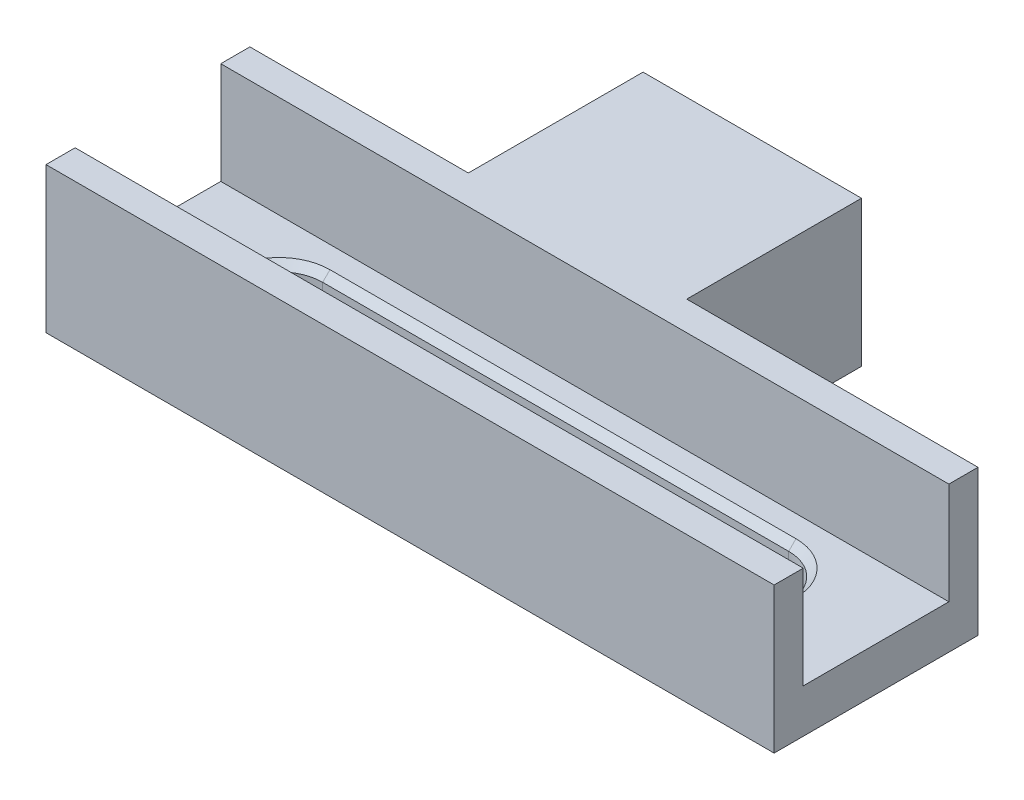
ISO-10303-21;
HEADER;
FILE_DESCRIPTION(('STEP AP214'),'2;1');
FILE_NAME('part.step','',(''),(''),'','','');
FILE_SCHEMA(('AUTOMOTIVE_DESIGN { 1 0 10303 214 1 1 1 1 }'));
ENDSEC;
DATA;
#1=APPLICATION_CONTEXT('core data for automotive mechanical design processes');
#2=APPLICATION_PROTOCOL_DEFINITION('international standard','automotive_design',2000,#1);
#3=PRODUCT_CONTEXT('',#1,'mechanical');
#4=PRODUCT('Part','Part','',(#3));
#5=PRODUCT_RELATED_PRODUCT_CATEGORY('part','',(#4));
#6=PRODUCT_DEFINITION_FORMATION('','',#4);
#7=PRODUCT_DEFINITION_CONTEXT('part definition',#1,'design');
#8=PRODUCT_DEFINITION('design','',#6,#7);
#9=PRODUCT_DEFINITION_SHAPE('','',#8);
#10=(LENGTH_UNIT() NAMED_UNIT(*) SI_UNIT(.MILLI.,.METRE.));
#11=(NAMED_UNIT(*) PLANE_ANGLE_UNIT() SI_UNIT($,.RADIAN.));
#12=(NAMED_UNIT(*) SI_UNIT($,.STERADIAN.) SOLID_ANGLE_UNIT());
#13=UNCERTAINTY_MEASURE_WITH_UNIT(LENGTH_MEASURE(1.E-05),#10,'distance_accuracy_value','');
#14=(GEOMETRIC_REPRESENTATION_CONTEXT(3) GLOBAL_UNCERTAINTY_ASSIGNED_CONTEXT((#13)) GLOBAL_UNIT_ASSIGNED_CONTEXT((#10,
#11,#12)) REPRESENTATION_CONTEXT('',''));
#15=CARTESIAN_POINT('',(0.,0.,0.));
#16=DIRECTION('',(0.,0.,1.));
#17=DIRECTION('',(1.,0.,0.));
#18=AXIS2_PLACEMENT_3D('',#15,#16,#17);
#19=CARTESIAN_POINT('',(0.,0.,0.));
#20=DIRECTION('',(0.,1.,0.));
#21=DIRECTION('',(0.,0.,1.));
#22=AXIS2_PLACEMENT_3D('',#19,#20,#21);
#23=PLANE('',#22);
#24=CARTESIAN_POINT('',(16.,0.,0.));
#25=DIRECTION('',(0.,1.,0.));
#26=DIRECTION('',(0.,0.,1.));
#27=AXIS2_PLACEMENT_3D('',#24,#25,#26);
#28=CIRCLE('',#27,3.5);
#29=CARTESIAN_POINT('',(16.,0.,3.49999999999999));
#30=VERTEX_POINT('',#29);
#31=CARTESIAN_POINT('',(16.,0.,-3.50000000000001));
#32=VERTEX_POINT('',#31);
#33=EDGE_CURVE('E300',#30,#32,#28,.T.);
#34=ORIENTED_EDGE('',*,*,#33,.T.);
#35=DIRECTION('',(-1.,0.,0.));
#36=VECTOR('',#35,1.);
#37=CARTESIAN_POINT('',(-16.,0.,-3.5));
#38=LINE('',#37,#36);
#39=CARTESIAN_POINT('',(-16.,0.,-3.5));
#40=VERTEX_POINT('',#39);
#41=EDGE_CURVE('E304',#32,#40,#38,.T.);
#42=ORIENTED_EDGE('',*,*,#41,.T.);
#43=CARTESIAN_POINT('',(-16.,0.,0.));
#44=DIRECTION('',(0.,1.,0.));
#45=DIRECTION('',(0.,0.,1.));
#46=AXIS2_PLACEMENT_3D('',#43,#44,#45);
#47=CIRCLE('',#46,3.5);
#48=CARTESIAN_POINT('',(-16.,0.,3.5));
#49=VERTEX_POINT('',#48);
#50=EDGE_CURVE('E302',#40,#49,#47,.T.);
#51=ORIENTED_EDGE('',*,*,#50,.T.);
#52=DIRECTION('',(1.,0.,0.));
#53=VECTOR('',#52,1.);
#54=CARTESIAN_POINT('',(16.,0.,3.49999999999999));
#55=LINE('',#54,#53);
#56=EDGE_CURVE('E298',#49,#30,#55,.T.);
#57=ORIENTED_EDGE('',*,*,#56,.T.);
#58=EDGE_LOOP('',(#34,#42,#51,#57));
#59=FACE_BOUND('',#58,.T.);
#60=DIRECTION('',(0.,0.,-1.));
#61=VECTOR('',#60,1.);
#62=CARTESIAN_POINT('',(25.,0.,-7.));
#63=LINE('',#62,#61);
#64=CARTESIAN_POINT('',(25.,0.,7.));
#65=VERTEX_POINT('',#64);
#66=CARTESIAN_POINT('',(25.,0.,-7.));
#67=VERTEX_POINT('',#66);
#68=EDGE_CURVE('E233',#65,#67,#63,.T.);
#69=ORIENTED_EDGE('',*,*,#68,.F.);
#70=DIRECTION('',(1.,0.,0.));
#71=VECTOR('',#70,1.);
#72=CARTESIAN_POINT('',(-25.,0.,7.));
#73=LINE('',#72,#71);
#74=CARTESIAN_POINT('',(-25.,0.,7.));
#75=VERTEX_POINT('',#74);
#76=EDGE_CURVE('E269',#75,#65,#73,.T.);
#77=ORIENTED_EDGE('',*,*,#76,.F.);
#78=DIRECTION('',(0.,0.,1.));
#79=VECTOR('',#78,1.);
#80=CARTESIAN_POINT('',(-25.,0.,-7.));
#81=LINE('',#80,#79);
#82=CARTESIAN_POINT('',(-25.,0.,-7.));
#83=VERTEX_POINT('',#82);
#84=EDGE_CURVE('E267',#83,#75,#81,.T.);
#85=ORIENTED_EDGE('',*,*,#84,.F.);
#86=DIRECTION('',(-1.,0.,0.));
#87=VECTOR('',#86,1.);
#88=CARTESIAN_POINT('',(-25.,0.,-7.));
#89=LINE('',#88,#87);
#90=CARTESIAN_POINT('',(-10.,0.,-7.));
#91=VERTEX_POINT('',#90);
#92=EDGE_CURVE('E265',#91,#83,#89,.T.);
#93=ORIENTED_EDGE('',*,*,#92,.F.);
#94=DIRECTION('',(0.,0.,1.));
#95=VECTOR('',#94,1.);
#96=CARTESIAN_POINT('',(-10.,0.,-7.));
#97=LINE('',#96,#95);
#98=CARTESIAN_POINT('',(-10.,0.,-19.));
#99=VERTEX_POINT('',#98);
#100=EDGE_CURVE('E263',#99,#91,#97,.T.);
#101=ORIENTED_EDGE('',*,*,#100,.F.);
#102=DIRECTION('',(-1.,0.,0.));
#103=VECTOR('',#102,1.);
#104=CARTESIAN_POINT('',(-10.,0.,-19.));
#105=LINE('',#104,#103);
#106=CARTESIAN_POINT('',(4.99999999999999,0.,-19.));
#107=VERTEX_POINT('',#106);
#108=EDGE_CURVE('E261',#107,#99,#105,.T.);
#109=ORIENTED_EDGE('',*,*,#108,.F.);
#110=DIRECTION('',(0.,0.,-1.));
#111=VECTOR('',#110,1.);
#112=CARTESIAN_POINT('',(4.99999999999999,0.,-19.));
#113=LINE('',#112,#111);
#114=CARTESIAN_POINT('',(4.99999999999999,0.,-7.));
#115=VERTEX_POINT('',#114);
#116=EDGE_CURVE('E259',#115,#107,#113,.T.);
#117=ORIENTED_EDGE('',*,*,#116,.F.);
#118=DIRECTION('',(-1.,0.,0.));
#119=VECTOR('',#118,1.);
#120=CARTESIAN_POINT('',(4.99999999999999,0.,-7.));
#121=LINE('',#120,#119);
#122=EDGE_CURVE('E257',#67,#115,#121,.T.);
#123=ORIENTED_EDGE('',*,*,#122,.F.);
#124=EDGE_LOOP('',(#69,#77,#85,#93,#101,#109,#117,#123));
#125=FACE_BOUND('',#124,.T.);
#126=ADVANCED_FACE('F36',(#59,#125),#23,.F.);
#127=CARTESIAN_POINT('',(46.,3.,5.));
#128=DIRECTION('',(0.,-1.,0.));
#129=DIRECTION('',(0.,0.,-1.));
#130=AXIS2_PLACEMENT_3D('',#127,#128,#129);
#131=PLANE('',#130);
#132=CARTESIAN_POINT('',(-16.,3.,0.));
#133=DIRECTION('',(0.,-1.,0.));
#134=DIRECTION('',(0.,0.,-1.));
#135=AXIS2_PLACEMENT_3D('',#132,#133,#134);
#136=CIRCLE('',#135,3.49999999999999);
#137=CARTESIAN_POINT('',(-16.,3.,3.49999999999999));
#138=VERTEX_POINT('',#137);
#139=CARTESIAN_POINT('',(-16.,3.,-3.49999999999999));
#140=VERTEX_POINT('',#139);
#141=EDGE_CURVE('E54',#138,#140,#136,.T.);
#142=ORIENTED_EDGE('',*,*,#141,.T.);
#143=DIRECTION('',(1.,0.,0.));
#144=VECTOR('',#143,1.);
#145=CARTESIAN_POINT('',(16.,3.,-3.5));
#146=LINE('',#145,#144);
#147=CARTESIAN_POINT('',(16.,3.,-3.5));
#148=VERTEX_POINT('',#147);
#149=EDGE_CURVE('E330',#140,#148,#146,.T.);
#150=ORIENTED_EDGE('',*,*,#149,.T.);
#151=CARTESIAN_POINT('',(16.,3.,0.));
#152=DIRECTION('',(0.,-1.,0.));
#153=DIRECTION('',(0.,0.,-1.));
#154=AXIS2_PLACEMENT_3D('',#151,#152,#153);
#155=CIRCLE('',#154,3.49999999999999);
#156=CARTESIAN_POINT('',(16.,3.,3.49999999999999));
#157=VERTEX_POINT('',#156);
#158=EDGE_CURVE('E327',#148,#157,#155,.T.);
#159=ORIENTED_EDGE('',*,*,#158,.T.);
#160=DIRECTION('',(-1.,0.,0.));
#161=VECTOR('',#160,1.);
#162=CARTESIAN_POINT('',(-16.,3.,3.49999999999999));
#163=LINE('',#162,#161);
#164=EDGE_CURVE('E325',#157,#138,#163,.T.);
#165=ORIENTED_EDGE('',*,*,#164,.T.);
#166=EDGE_LOOP('',(#142,#150,#159,#165));
#167=FACE_BOUND('',#166,.T.);
#168=DIRECTION('',(-1.,0.,0.));
#169=VECTOR('',#168,1.);
#170=CARTESIAN_POINT('',(46.,3.,-5.));
#171=LINE('',#170,#169);
#172=CARTESIAN_POINT('',(25.,3.,-5.));
#173=VERTEX_POINT('',#172);
#174=CARTESIAN_POINT('',(-25.,3.,-5.));
#175=VERTEX_POINT('',#174);
#176=EDGE_CURVE('E220',#173,#175,#171,.T.);
#177=ORIENTED_EDGE('',*,*,#176,.T.);
#178=DIRECTION('',(0.,0.,1.));
#179=VECTOR('',#178,1.);
#180=CARTESIAN_POINT('',(-25.,3.,5.));
#181=LINE('',#180,#179);
#182=CARTESIAN_POINT('',(-25.,3.,5.));
#183=VERTEX_POINT('',#182);
#184=EDGE_CURVE('E215',#175,#183,#181,.T.);
#185=ORIENTED_EDGE('',*,*,#184,.T.);
#186=DIRECTION('',(-1.,0.,0.));
#187=VECTOR('',#186,1.);
#188=CARTESIAN_POINT('',(46.,3.,5.));
#189=LINE('',#188,#187);
#190=CARTESIAN_POINT('',(25.,3.,5.));
#191=VERTEX_POINT('',#190);
#192=EDGE_CURVE('E221',#191,#183,#189,.T.);
#193=ORIENTED_EDGE('',*,*,#192,.F.);
#194=DIRECTION('',(0.,0.,1.));
#195=VECTOR('',#194,1.);
#196=CARTESIAN_POINT('',(25.,3.,-7.));
#197=LINE('',#196,#195);
#198=EDGE_CURVE('E230',#173,#191,#197,.T.);
#199=ORIENTED_EDGE('',*,*,#198,.F.);
#200=EDGE_LOOP('',(#177,#185,#193,#199));
#201=FACE_BOUND('',#200,.T.);
#202=ADVANCED_FACE('F365',(#167,#201),#131,.F.);
#203=CARTESIAN_POINT('',(0.,10.,0.));
#204=DIRECTION('',(0.,1.,0.));
#205=DIRECTION('',(0.,0.,1.));
#206=AXIS2_PLACEMENT_3D('',#203,#204,#205);
#207=PLANE('',#206);
#208=DIRECTION('',(-1.,0.,0.));
#209=VECTOR('',#208,1.);
#210=CARTESIAN_POINT('',(0.,10.,-5.));
#211=LINE('',#210,#209);
#212=CARTESIAN_POINT('',(25.,10.,-5.));
#213=VERTEX_POINT('',#212);
#214=CARTESIAN_POINT('',(-25.,10.,-5.));
#215=VERTEX_POINT('',#214);
#216=EDGE_CURVE('E296',#213,#215,#211,.T.);
#217=ORIENTED_EDGE('',*,*,#216,.F.);
#218=DIRECTION('',(0.,0.,-1.));
#219=VECTOR('',#218,1.);
#220=CARTESIAN_POINT('',(25.,10.,-7.));
#221=LINE('',#220,#219);
#222=CARTESIAN_POINT('',(25.,10.,-7.));
#223=VERTEX_POINT('',#222);
#224=EDGE_CURVE('E238',#213,#223,#221,.T.);
#225=ORIENTED_EDGE('',*,*,#224,.T.);
#226=DIRECTION('',(-1.,0.,0.));
#227=VECTOR('',#226,1.);
#228=CARTESIAN_POINT('',(4.99999999999999,10.,-7.));
#229=LINE('',#228,#227);
#230=CARTESIAN_POINT('',(4.99999999999999,10.,-7.));
#231=VERTEX_POINT('',#230);
#232=EDGE_CURVE('E237',#223,#231,#229,.T.);
#233=ORIENTED_EDGE('',*,*,#232,.T.);
#234=DIRECTION('',(0.,0.,-1.));
#235=VECTOR('',#234,1.);
#236=CARTESIAN_POINT('',(4.99999999999999,10.,-19.));
#237=LINE('',#236,#235);
#238=CARTESIAN_POINT('',(4.99999999999999,10.,-19.));
#239=VERTEX_POINT('',#238);
#240=EDGE_CURVE('E240',#231,#239,#237,.T.);
#241=ORIENTED_EDGE('',*,*,#240,.T.);
#242=DIRECTION('',(-1.,0.,0.));
#243=VECTOR('',#242,1.);
#244=CARTESIAN_POINT('',(-10.,10.,-19.));
#245=LINE('',#244,#243);
#246=CARTESIAN_POINT('',(-10.,10.,-19.));
#247=VERTEX_POINT('',#246);
#248=EDGE_CURVE('E242',#239,#247,#245,.T.);
#249=ORIENTED_EDGE('',*,*,#248,.T.);
#250=DIRECTION('',(0.,0.,1.));
#251=VECTOR('',#250,1.);
#252=CARTESIAN_POINT('',(-10.,10.,-7.));
#253=LINE('',#252,#251);
#254=CARTESIAN_POINT('',(-10.,10.,-7.));
#255=VERTEX_POINT('',#254);
#256=EDGE_CURVE('E244',#247,#255,#253,.T.);
#257=ORIENTED_EDGE('',*,*,#256,.T.);
#258=DIRECTION('',(-1.,0.,0.));
#259=VECTOR('',#258,1.);
#260=CARTESIAN_POINT('',(-25.,10.,-7.));
#261=LINE('',#260,#259);
#262=CARTESIAN_POINT('',(-25.,10.,-7.));
#263=VERTEX_POINT('',#262);
#264=EDGE_CURVE('E246',#255,#263,#261,.T.);
#265=ORIENTED_EDGE('',*,*,#264,.T.);
#266=DIRECTION('',(0.,0.,1.));
#267=VECTOR('',#266,1.);
#268=CARTESIAN_POINT('',(-25.,10.,-7.));
#269=LINE('',#268,#267);
#270=EDGE_CURVE('E249',#263,#215,#269,.T.);
#271=ORIENTED_EDGE('',*,*,#270,.T.);
#272=EDGE_LOOP('',(#217,#225,#233,#241,#249,#257,#265,#271));
#273=FACE_BOUND('',#272,.T.);
#274=ADVANCED_FACE('F450',(#273),#207,.T.);
#275=CARTESIAN_POINT('',(25.,10.,-7.));
#276=DIRECTION('',(-1.,0.,0.));
#277=DIRECTION('',(0.,0.,1.));
#278=AXIS2_PLACEMENT_3D('',#275,#276,#277);
#279=PLANE('',#278);
#280=ORIENTED_EDGE('',*,*,#224,.F.);
#281=DIRECTION('',(0.,-1.,0.));
#282=VECTOR('',#281,1.);
#283=CARTESIAN_POINT('',(25.,10.,-5.));
#284=LINE('',#283,#282);
#285=EDGE_CURVE('E227',#213,#173,#284,.T.);
#286=ORIENTED_EDGE('',*,*,#285,.T.);
#287=ORIENTED_EDGE('',*,*,#198,.T.);
#288=DIRECTION('',(0.,1.,0.));
#289=VECTOR('',#288,1.);
#290=CARTESIAN_POINT('',(25.,10.,5.));
#291=LINE('',#290,#289);
#292=CARTESIAN_POINT('',(25.,10.,5.));
#293=VERTEX_POINT('',#292);
#294=EDGE_CURVE('E223',#191,#293,#291,.T.);
#295=ORIENTED_EDGE('',*,*,#294,.T.);
#296=CARTESIAN_POINT('',(25.,10.,7.));
#297=VERTEX_POINT('',#296);
#298=EDGE_CURVE('E234',#297,#293,#221,.T.);
#299=ORIENTED_EDGE('',*,*,#298,.F.);
#300=DIRECTION('',(0.,-1.,0.));
#301=VECTOR('',#300,1.);
#302=CARTESIAN_POINT('',(25.,10.,7.));
#303=LINE('',#302,#301);
#304=EDGE_CURVE('E254',#297,#65,#303,.T.);
#305=ORIENTED_EDGE('',*,*,#304,.T.);
#306=ORIENTED_EDGE('',*,*,#68,.T.);
#307=DIRECTION('',(0.,-1.,0.));
#308=VECTOR('',#307,1.);
#309=CARTESIAN_POINT('',(25.,10.,-7.));
#310=LINE('',#309,#308);
#311=EDGE_CURVE('E291',#223,#67,#310,.T.);
#312=ORIENTED_EDGE('',*,*,#311,.F.);
#313=EDGE_LOOP('',(#280,#286,#287,#295,#299,#305,#306,#312));
#314=FACE_BOUND('',#313,.T.);
#315=ADVANCED_FACE('F412',(#314),#279,.F.);
#316=CARTESIAN_POINT('',(4.99999999999999,10.,-7.));
#317=DIRECTION('',(0.,0.,1.));
#318=DIRECTION('',(1.,0.,0.));
#319=AXIS2_PLACEMENT_3D('',#316,#317,#318);
#320=PLANE('',#319);
#321=ORIENTED_EDGE('',*,*,#122,.T.);
#322=DIRECTION('',(0.,-1.,0.));
#323=VECTOR('',#322,1.);
#324=CARTESIAN_POINT('',(4.99999999999999,10.,-7.));
#325=LINE('',#324,#323);
#326=EDGE_CURVE('E288',#231,#115,#325,.T.);
#327=ORIENTED_EDGE('',*,*,#326,.F.);
#328=ORIENTED_EDGE('',*,*,#232,.F.);
#329=ORIENTED_EDGE('',*,*,#311,.T.);
#330=EDGE_LOOP('',(#321,#327,#328,#329));
#331=FACE_BOUND('',#330,.T.);
#332=ADVANCED_FACE('F447',(#331),#320,.F.);
#333=CARTESIAN_POINT('',(4.99999999999999,10.,-19.));
#334=DIRECTION('',(-1.,0.,0.));
#335=DIRECTION('',(0.,0.,1.));
#336=AXIS2_PLACEMENT_3D('',#333,#334,#335);
#337=PLANE('',#336);
#338=ORIENTED_EDGE('',*,*,#116,.T.);
#339=DIRECTION('',(0.,-1.,0.));
#340=VECTOR('',#339,1.);
#341=CARTESIAN_POINT('',(4.99999999999999,10.,-19.));
#342=LINE('',#341,#340);
#343=EDGE_CURVE('E285',#239,#107,#342,.T.);
#344=ORIENTED_EDGE('',*,*,#343,.F.);
#345=ORIENTED_EDGE('',*,*,#240,.F.);
#346=ORIENTED_EDGE('',*,*,#326,.T.);
#347=EDGE_LOOP('',(#338,#344,#345,#346));
#348=FACE_BOUND('',#347,.T.);
#349=ADVANCED_FACE('F442',(#348),#337,.F.);
#350=CARTESIAN_POINT('',(-10.,10.,-19.));
#351=DIRECTION('',(0.,0.,1.));
#352=DIRECTION('',(1.,0.,0.));
#353=AXIS2_PLACEMENT_3D('',#350,#351,#352);
#354=PLANE('',#353);
#355=CARTESIAN_POINT('',(0.,5.,-19.));
#356=DIRECTION('',(0.,0.,1.));
#357=DIRECTION('',(1.,0.,0.));
#358=AXIS2_PLACEMENT_3D('',#355,#356,#357);
#359=CIRCLE('',#358,2.999995);
#360=CARTESIAN_POINT('',(2.999995,5.,-19.));
#361=VERTEX_POINT('',#360);
#362=EDGE_CURVE('E11',#361,#361,#359,.T.);
#363=ORIENTED_EDGE('',*,*,#362,.T.);
#364=EDGE_LOOP('',(#363));
#365=FACE_BOUND('',#364,.T.);
#366=ORIENTED_EDGE('',*,*,#108,.T.);
#367=DIRECTION('',(0.,-1.,0.));
#368=VECTOR('',#367,1.);
#369=CARTESIAN_POINT('',(-10.,10.,-19.));
#370=LINE('',#369,#368);
#371=EDGE_CURVE('E282',#247,#99,#370,.T.);
#372=ORIENTED_EDGE('',*,*,#371,.F.);
#373=ORIENTED_EDGE('',*,*,#248,.F.);
#374=ORIENTED_EDGE('',*,*,#343,.T.);
#375=EDGE_LOOP('',(#366,#372,#373,#374));
#376=FACE_BOUND('',#375,.T.);
#377=ADVANCED_FACE('F439',(#365,#376),#354,.F.);
#378=CARTESIAN_POINT('',(-10.,10.,-7.));
#379=DIRECTION('',(1.,0.,0.));
#380=DIRECTION('',(0.,0.,-1.));
#381=AXIS2_PLACEMENT_3D('',#378,#379,#380);
#382=PLANE('',#381);
#383=CARTESIAN_POINT('',(-10.,5.,-13.));
#384=DIRECTION('',(1.,0.,0.));
#385=DIRECTION('',(0.,0.,-1.));
#386=AXIS2_PLACEMENT_3D('',#383,#384,#385);
#387=CIRCLE('',#386,2.75000000000001);
#388=CARTESIAN_POINT('',(-10.,5.,-15.75));
#389=VERTEX_POINT('',#388);
#390=EDGE_CURVE('E335',#389,#389,#387,.T.);
#391=ORIENTED_EDGE('',*,*,#390,.T.);
#392=EDGE_LOOP('',(#391));
#393=FACE_BOUND('',#392,.T.);
#394=ORIENTED_EDGE('',*,*,#100,.T.);
#395=DIRECTION('',(0.,-1.,0.));
#396=VECTOR('',#395,1.);
#397=CARTESIAN_POINT('',(-10.,10.,-7.));
#398=LINE('',#397,#396);
#399=EDGE_CURVE('E279',#255,#91,#398,.T.);
#400=ORIENTED_EDGE('',*,*,#399,.F.);
#401=ORIENTED_EDGE('',*,*,#256,.F.);
#402=ORIENTED_EDGE('',*,*,#371,.T.);
#403=EDGE_LOOP('',(#394,#400,#401,#402));
#404=FACE_BOUND('',#403,.T.);
#405=ADVANCED_FACE('F435',(#393,#404),#382,.F.);
#406=CARTESIAN_POINT('',(-25.,10.,-7.));
#407=DIRECTION('',(0.,0.,1.));
#408=DIRECTION('',(1.,0.,0.));
#409=AXIS2_PLACEMENT_3D('',#406,#407,#408);
#410=PLANE('',#409);
#411=ORIENTED_EDGE('',*,*,#92,.T.);
#412=DIRECTION('',(0.,-1.,0.));
#413=VECTOR('',#412,1.);
#414=CARTESIAN_POINT('',(-25.,10.,-7.));
#415=LINE('',#414,#413);
#416=EDGE_CURVE('E276',#263,#83,#415,.T.);
#417=ORIENTED_EDGE('',*,*,#416,.F.);
#418=ORIENTED_EDGE('',*,*,#264,.F.);
#419=ORIENTED_EDGE('',*,*,#399,.T.);
#420=EDGE_LOOP('',(#411,#417,#418,#419));
#421=FACE_BOUND('',#420,.T.);
#422=ADVANCED_FACE('F430',(#421),#410,.F.);
#423=CARTESIAN_POINT('',(-25.,10.,-7.));
#424=DIRECTION('',(1.,0.,0.));
#425=DIRECTION('',(0.,0.,-1.));
#426=AXIS2_PLACEMENT_3D('',#423,#424,#425);
#427=PLANE('',#426);
#428=ORIENTED_EDGE('',*,*,#184,.F.);
#429=DIRECTION('',(0.,-1.,0.));
#430=VECTOR('',#429,1.);
#431=CARTESIAN_POINT('',(-25.,3.,-5.));
#432=LINE('',#431,#430);
#433=EDGE_CURVE('E212',#215,#175,#432,.T.);
#434=ORIENTED_EDGE('',*,*,#433,.F.);
#435=ORIENTED_EDGE('',*,*,#270,.F.);
#436=ORIENTED_EDGE('',*,*,#416,.T.);
#437=ORIENTED_EDGE('',*,*,#84,.T.);
#438=DIRECTION('',(0.,-1.,0.));
#439=VECTOR('',#438,1.);
#440=CARTESIAN_POINT('',(-25.,10.,7.));
#441=LINE('',#440,#439);
#442=CARTESIAN_POINT('',(-25.,10.,7.));
#443=VERTEX_POINT('',#442);
#444=EDGE_CURVE('E273',#443,#75,#441,.T.);
#445=ORIENTED_EDGE('',*,*,#444,.F.);
#446=CARTESIAN_POINT('',(-25.,10.,5.));
#447=VERTEX_POINT('',#446);
#448=EDGE_CURVE('E248',#447,#443,#269,.T.);
#449=ORIENTED_EDGE('',*,*,#448,.F.);
#450=DIRECTION('',(0.,1.,0.));
#451=VECTOR('',#450,1.);
#452=CARTESIAN_POINT('',(-25.,3.,5.));
#453=LINE('',#452,#451);
#454=EDGE_CURVE('E218',#183,#447,#453,.T.);
#455=ORIENTED_EDGE('',*,*,#454,.F.);
#456=EDGE_LOOP('',(#428,#434,#435,#436,#437,#445,#449,#455));
#457=FACE_BOUND('',#456,.T.);
#458=ADVANCED_FACE('F422',(#457),#427,.F.);
#459=CARTESIAN_POINT('',(-25.,10.,7.));
#460=DIRECTION('',(0.,0.,-1.));
#461=DIRECTION('',(-1.,0.,0.));
#462=AXIS2_PLACEMENT_3D('',#459,#460,#461);
#463=PLANE('',#462);
#464=ORIENTED_EDGE('',*,*,#76,.T.);
#465=ORIENTED_EDGE('',*,*,#304,.F.);
#466=DIRECTION('',(1.,0.,0.));
#467=VECTOR('',#466,1.);
#468=CARTESIAN_POINT('',(-25.,10.,7.));
#469=LINE('',#468,#467);
#470=EDGE_CURVE('E252',#443,#297,#469,.T.);
#471=ORIENTED_EDGE('',*,*,#470,.F.);
#472=ORIENTED_EDGE('',*,*,#444,.T.);
#473=EDGE_LOOP('',(#464,#465,#471,#472));
#474=FACE_BOUND('',#473,.T.);
#475=ADVANCED_FACE('F417',(#474),#463,.F.);
#476=DIRECTION('',(1.,0.,0.));
#477=VECTOR('',#476,1.);
#478=CARTESIAN_POINT('',(0.,10.,5.));
#479=LINE('',#478,#477);
#480=EDGE_CURVE('E294',#447,#293,#479,.T.);
#481=ORIENTED_EDGE('',*,*,#480,.F.);
#482=ORIENTED_EDGE('',*,*,#448,.T.);
#483=ORIENTED_EDGE('',*,*,#470,.T.);
#484=ORIENTED_EDGE('',*,*,#298,.T.);
#485=EDGE_LOOP('',(#481,#482,#483,#484));
#486=FACE_BOUND('',#485,.T.);
#487=ADVANCED_FACE('F460',(#486),#207,.T.);
#488=CARTESIAN_POINT('',(46.,3.,-5.));
#489=DIRECTION('',(0.,0.,-1.));
#490=DIRECTION('',(-1.,0.,0.));
#491=AXIS2_PLACEMENT_3D('',#488,#489,#490);
#492=PLANE('',#491);
#493=ORIENTED_EDGE('',*,*,#216,.T.);
#494=ORIENTED_EDGE('',*,*,#433,.T.);
#495=ORIENTED_EDGE('',*,*,#176,.F.);
#496=ORIENTED_EDGE('',*,*,#285,.F.);
#497=EDGE_LOOP('',(#493,#494,#495,#496));
#498=FACE_BOUND('',#497,.T.);
#499=ADVANCED_FACE('F453',(#498),#492,.F.);
#500=CARTESIAN_POINT('',(46.,3.,5.));
#501=DIRECTION('',(0.,0.,1.));
#502=DIRECTION('',(1.,0.,0.));
#503=AXIS2_PLACEMENT_3D('',#500,#501,#502);
#504=PLANE('',#503);
#505=ORIENTED_EDGE('',*,*,#192,.T.);
#506=ORIENTED_EDGE('',*,*,#454,.T.);
#507=ORIENTED_EDGE('',*,*,#480,.T.);
#508=ORIENTED_EDGE('',*,*,#294,.F.);
#509=EDGE_LOOP('',(#505,#506,#507,#508));
#510=FACE_BOUND('',#509,.T.);
#511=ADVANCED_FACE('F457',(#510),#504,.F.);
#512=CARTESIAN_POINT('',(-16.,71.,0.));
#513=DIRECTION('',(0.,-1.,0.));
#514=DIRECTION('',(0.,0.,-1.));
#515=AXIS2_PLACEMENT_3D('',#512,#513,#514);
#516=CYLINDRICAL_SURFACE('',#515,3.);
#517=DIRECTION('',(0.,-1.,0.));
#518=VECTOR('',#517,1.);
#519=CARTESIAN_POINT('',(-16.,71.,3.));
#520=LINE('',#519,#518);
#521=CARTESIAN_POINT('',(-16.,2.50000000000002,3.));
#522=VERTEX_POINT('',#521);
#523=CARTESIAN_POINT('',(-16.,0.5,3.));
#524=VERTEX_POINT('',#523);
#525=EDGE_CURVE('E209',#522,#524,#520,.T.);
#526=ORIENTED_EDGE('',*,*,#525,.T.);
#527=CARTESIAN_POINT('',(-16.,0.5,0.));
#528=DIRECTION('',(0.,1.,0.));
#529=DIRECTION('',(0.,0.,1.));
#530=AXIS2_PLACEMENT_3D('',#527,#528,#529);
#531=CIRCLE('',#530,3.);
#532=CARTESIAN_POINT('',(-16.,0.5,-3.));
#533=VERTEX_POINT('',#532);
#534=EDGE_CURVE('E315',#524,#533,#531,.F.);
#535=ORIENTED_EDGE('',*,*,#534,.T.);
#536=DIRECTION('',(0.,-1.,0.));
#537=VECTOR('',#536,1.);
#538=CARTESIAN_POINT('',(-16.,71.,-3.));
#539=LINE('',#538,#537);
#540=CARTESIAN_POINT('',(-16.,2.50000000000002,-3.));
#541=VERTEX_POINT('',#540);
#542=EDGE_CURVE('E189',#541,#533,#539,.T.);
#543=ORIENTED_EDGE('',*,*,#542,.F.);
#544=CARTESIAN_POINT('',(-16.,2.50000000000002,0.));
#545=DIRECTION('',(0.,-1.,0.));
#546=DIRECTION('',(0.,0.,-1.));
#547=AXIS2_PLACEMENT_3D('',#544,#545,#546);
#548=CIRCLE('',#547,3.);
#549=EDGE_CURVE('E313',#541,#522,#548,.F.);
#550=ORIENTED_EDGE('',*,*,#549,.T.);
#551=EDGE_LOOP('',(#526,#535,#543,#550));
#552=FACE_BOUND('',#551,.T.);
#553=ADVANCED_FACE('F376',(#552),#516,.F.);
#554=CARTESIAN_POINT('',(-16.,71.,3.));
#555=DIRECTION('',(0.,0.,-1.));
#556=DIRECTION('',(-1.,0.,0.));
#557=AXIS2_PLACEMENT_3D('',#554,#555,#556);
#558=PLANE('',#557);
#559=DIRECTION('',(0.,-1.,0.));
#560=VECTOR('',#559,1.);
#561=CARTESIAN_POINT('',(16.,71.,2.99999999999999));
#562=LINE('',#561,#560);
#563=CARTESIAN_POINT('',(16.,2.50000000000002,2.99999999999999));
#564=VERTEX_POINT('',#563);
#565=CARTESIAN_POINT('',(16.,0.5,2.99999999999999));
#566=VERTEX_POINT('',#565);
#567=EDGE_CURVE('E206',#564,#566,#562,.T.);
#568=ORIENTED_EDGE('',*,*,#567,.T.);
#569=DIRECTION('',(-1.,0.,0.));
#570=VECTOR('',#569,1.);
#571=CARTESIAN_POINT('',(-16.,0.5,3.));
#572=LINE('',#571,#570);
#573=EDGE_CURVE('E323',#566,#524,#572,.T.);
#574=ORIENTED_EDGE('',*,*,#573,.T.);
#575=ORIENTED_EDGE('',*,*,#525,.F.);
#576=DIRECTION('',(1.,0.,0.));
#577=VECTOR('',#576,1.);
#578=CARTESIAN_POINT('',(16.,2.50000000000002,2.99999999999999));
#579=LINE('',#578,#577);
#580=EDGE_CURVE('E321',#522,#564,#579,.T.);
#581=ORIENTED_EDGE('',*,*,#580,.T.);
#582=EDGE_LOOP('',(#568,#574,#575,#581));
#583=FACE_BOUND('',#582,.T.);
#584=ADVANCED_FACE('F393',(#583),#558,.T.);
#585=CARTESIAN_POINT('',(16.,71.,0.));
#586=DIRECTION('',(0.,-1.,0.));
#587=DIRECTION('',(0.,0.,-1.));
#588=AXIS2_PLACEMENT_3D('',#585,#586,#587);
#589=CYLINDRICAL_SURFACE('',#588,3.);
#590=DIRECTION('',(0.,-1.,0.));
#591=VECTOR('',#590,1.);
#592=CARTESIAN_POINT('',(16.,71.,-3.00000000000001));
#593=LINE('',#592,#591);
#594=CARTESIAN_POINT('',(16.,2.50000000000002,-3.00000000000001));
#595=VERTEX_POINT('',#594);
#596=CARTESIAN_POINT('',(16.,0.5,-3.00000000000001));
#597=VERTEX_POINT('',#596);
#598=EDGE_CURVE('E193',#595,#597,#593,.T.);
#599=ORIENTED_EDGE('',*,*,#598,.T.);
#600=CARTESIAN_POINT('',(16.,0.5,0.));
#601=DIRECTION('',(0.,1.,0.));
#602=DIRECTION('',(0.,0.,1.));
#603=AXIS2_PLACEMENT_3D('',#600,#601,#602);
#604=CIRCLE('',#603,3.);
#605=EDGE_CURVE('E319',#597,#566,#604,.F.);
#606=ORIENTED_EDGE('',*,*,#605,.T.);
#607=ORIENTED_EDGE('',*,*,#567,.F.);
#608=CARTESIAN_POINT('',(16.,2.50000000000002,0.));
#609=DIRECTION('',(0.,-1.,0.));
#610=DIRECTION('',(0.,0.,-1.));
#611=AXIS2_PLACEMENT_3D('',#608,#609,#610);
#612=CIRCLE('',#611,3.);
#613=EDGE_CURVE('E317',#564,#595,#612,.F.);
#614=ORIENTED_EDGE('',*,*,#613,.T.);
#615=EDGE_LOOP('',(#599,#606,#607,#614));
#616=FACE_BOUND('',#615,.T.);
#617=ADVANCED_FACE('F389',(#616),#589,.F.);
#618=CARTESIAN_POINT('',(-16.,71.,-3.));
#619=DIRECTION('',(0.,0.,1.));
#620=DIRECTION('',(1.,0.,0.));
#621=AXIS2_PLACEMENT_3D('',#618,#619,#620);
#622=PLANE('',#621);
#623=ORIENTED_EDGE('',*,*,#542,.T.);
#624=DIRECTION('',(1.,0.,0.));
#625=VECTOR('',#624,1.);
#626=CARTESIAN_POINT('',(16.,0.5,-3.00000000000001));
#627=LINE('',#626,#625);
#628=EDGE_CURVE('E310',#533,#597,#627,.T.);
#629=ORIENTED_EDGE('',*,*,#628,.T.);
#630=ORIENTED_EDGE('',*,*,#598,.F.);
#631=DIRECTION('',(-1.,0.,0.));
#632=VECTOR('',#631,1.);
#633=CARTESIAN_POINT('',(-16.,2.50000000000002,-3.));
#634=LINE('',#633,#632);
#635=EDGE_CURVE('E307',#595,#541,#634,.T.);
#636=ORIENTED_EDGE('',*,*,#635,.T.);
#637=EDGE_LOOP('',(#623,#629,#630,#636));
#638=FACE_BOUND('',#637,.T.);
#639=ADVANCED_FACE('F183',(#638),#622,.T.);
#640=CARTESIAN_POINT('',(0.,5.,-9.));
#641=DIRECTION('',(0.,0.,-1.));
#642=DIRECTION('',(-1.,0.,0.));
#643=AXIS2_PLACEMENT_3D('',#640,#641,#642);
#644=CONICAL_SURFACE('',#643,2.499995,1.02974425867665);
#645=CARTESIAN_POINT('',(0.,5.,-7.4978514567342));
#646=VERTEX_POINT('',#645);
#647=VERTEX_LOOP('',#646);
#648=FACE_BOUND('',#647,.T.);
#649=CARTESIAN_POINT('',(0.,5.,-9.));
#650=DIRECTION('',(0.,0.,-1.));
#651=DIRECTION('',(-1.,0.,0.));
#652=AXIS2_PLACEMENT_3D('',#649,#650,#651);
#653=CIRCLE('',#652,2.499995);
#654=CARTESIAN_POINT('',(-2.499995,5.,-9.));
#655=VERTEX_POINT('',#654);
#656=EDGE_CURVE('E187',#655,#655,#653,.T.);
#657=ORIENTED_EDGE('',*,*,#656,.T.);
#658=EDGE_LOOP('',(#657));
#659=FACE_BOUND('',#658,.T.);
#660=ADVANCED_FACE('F179',(#648,#659),#644,.F.);
#661=CARTESIAN_POINT('',(0.,5.,-19.));
#662=DIRECTION('',(0.,0.,-1.));
#663=DIRECTION('',(-1.,0.,0.));
#664=AXIS2_PLACEMENT_3D('',#661,#662,#663);
#665=CYLINDRICAL_SURFACE('',#664,2.499995);
#666=CARTESIAN_POINT('',(0.,5.,-18.5));
#667=DIRECTION('',(0.,0.,1.));
#668=DIRECTION('',(1.,0.,0.));
#669=AXIS2_PLACEMENT_3D('',#666,#667,#668);
#670=CIRCLE('',#669,2.499995);
#671=CARTESIAN_POINT('',(2.499995,5.,-18.5));
#672=VERTEX_POINT('',#671);
#673=EDGE_CURVE('E46',#672,#672,#670,.F.);
#674=ORIENTED_EDGE('',*,*,#673,.T.);
#675=EDGE_LOOP('',(#674));
#676=FACE_BOUND('',#675,.T.);
#677=CARTESIAN_POINT('',(-2.499995,5.,-10.75));
#678=CARTESIAN_POINT('',(-2.49998838826752,4.8957205298802,-10.7500066931264));
#679=CARTESIAN_POINT('',(-2.49341233777929,4.79138615083259,-10.7573071439943));
#680=CARTESIAN_POINT('',(-2.46769093022233,4.58623580190187,-10.7859400435744));
#681=CARTESIAN_POINT('',(-2.44853300540817,4.48542345625089,-10.8072865225825));
#682=CARTESIAN_POINT('',(-2.39938560540671,4.29081780559319,-10.8623076237122));
#683=CARTESIAN_POINT('',(-2.36946569830372,4.19698398678531,-10.8959030840392));
#684=CARTESIAN_POINT('',(-2.30077641001199,4.01731204387475,-10.9735689415588));
#685=CARTESIAN_POINT('',(-2.26200376459213,3.93147688556295,-11.0176432028016));
#686=CARTESIAN_POINT('',(-2.16086924121504,3.73626924586211,-11.1337200869188));
#687=CARTESIAN_POINT('',(-2.09524858951923,3.63105122199896,-11.2098684468943));
#688=CARTESIAN_POINT('',(-1.95562019696749,3.43801678093933,-11.375510352645));
#689=CARTESIAN_POINT('',(-1.88159196874601,3.35024436916422,-11.4650366724838));
#690=CARTESIAN_POINT('',(-1.72802471545608,3.18990435893369,-11.6575619255292));
#691=CARTESIAN_POINT('',(-1.64839715604397,3.11774171673979,-11.7608276265804));
#692=CARTESIAN_POINT('',(-1.53070672933189,3.02276235236547,-11.9243692931153));
#693=CARTESIAN_POINT('',(-1.49178813613121,2.99332516457364,-11.9802924625375));
#694=CARTESIAN_POINT('',(-1.41563278894899,2.93889859074274,-12.0953384411594));
#695=CARTESIAN_POINT('',(-1.37839496867298,2.91390635433615,-12.1544591679391));
#696=CARTESIAN_POINT('',(-1.30729103410878,2.86863105202051,-12.2761430807616));
#697=CARTESIAN_POINT('',(-1.27341344743697,2.8483316241832,-12.3386933356536));
#698=CARTESIAN_POINT('',(-1.21133302760526,2.81278200235864,-12.4679646963219));
#699=CARTESIAN_POINT('',(-1.18312469093493,2.79752690213722,-12.5346816738902));
#700=CARTESIAN_POINT('',(-1.14001910490228,2.77495461870149,-12.6608161021781));
#701=CARTESIAN_POINT('',(-1.12367697058583,2.76673091398119,-12.7195577423786));
#702=CARTESIAN_POINT('',(-1.09996269198607,2.75495170131296,-12.8392240517075));
#703=CARTESIAN_POINT('',(-1.09256635336185,2.75138359998728,-12.9001423718215));
#704=CARTESIAN_POINT('',(-1.088222223918,2.74927631253753,-13.0227938435352));
#705=CARTESIAN_POINT('',(-1.09133073064244,2.75076422281537,-13.0845296137115));
#706=CARTESIAN_POINT('',(-1.10743017618359,2.75865113431396,-13.2064165110454));
#707=CARTESIAN_POINT('',(-1.12044281778481,2.76506092104394,-13.2665638576111));
#708=CARTESIAN_POINT('',(-1.16119591429067,2.78588554560895,-13.4091423643372));
#709=CARTESIAN_POINT('',(-1.19285835251519,2.80255391047832,-13.4900751087266));
#710=CARTESIAN_POINT('',(-1.26492913840279,2.84323196099737,-13.6460673408401));
#711=CARTESIAN_POINT('',(-1.3053740285303,2.86727249883975,-13.7211004485209));
#712=CARTESIAN_POINT('',(-1.38754499885021,2.91987820418881,-13.8606505065666));
#713=CARTESIAN_POINT('',(-1.42895540199517,2.94797757864862,-13.9255348199692));
#714=CARTESIAN_POINT('',(-1.51358676171603,3.00957939509397,-14.0514968903478));
#715=CARTESIAN_POINT('',(-1.5568090739262,3.04308593801549,-14.1125717089698));
#716=CARTESIAN_POINT('',(-1.64364591223606,3.11543155123925,-14.2311458769109));
#717=CARTESIAN_POINT('',(-1.68726030796937,3.15426890619394,-14.2886463677639));
#718=CARTESIAN_POINT('',(-1.77386281594307,3.23733439626065,-14.4001216167817));
#719=CARTESIAN_POINT('',(-1.8168508011426,3.28156360830579,-14.4540956672817));
#720=CARTESIAN_POINT('',(-1.93143153633959,3.40901030077656,-14.5955292086512));
#721=CARTESIAN_POINT('',(-2.00159401894406,3.497562487271,-14.6794627146275));
#722=CARTESIAN_POINT('',(-2.13311105405682,3.69101188207957,-14.8342086068689));
#723=CARTESIAN_POINT('',(-2.19448386605054,3.79587423344595,-14.9050482857025));
#724=CARTESIAN_POINT('',(-2.29135058044118,3.99550286780765,-15.0157758691653));
#725=CARTESIAN_POINT('',(-2.329551542421,4.08706925830629,-15.0590363149267));
#726=CARTESIAN_POINT('',(-2.39574032603503,4.27845321532871,-15.133633865423));
#727=CARTESIAN_POINT('',(-2.42373389269995,4.37826610155047,-15.1649776776249));
#728=CARTESIAN_POINT('',(-2.46752567584851,4.58468027429423,-15.2138943439479));
#729=CARTESIAN_POINT('',(-2.48323222548026,4.69132628218201,-15.2313637026516));
#730=CARTESIAN_POINT('',(-2.50060904831485,4.90714390646898,-15.2506864800213));
#731=CARTESIAN_POINT('',(-2.50228789665921,5.01631393899107,-15.2525494388899));
#732=CARTESIAN_POINT('',(-2.49211854181686,5.22024474639753,-15.2412458755607));
#733=CARTESIAN_POINT('',(-2.48183759749179,5.31519051568853,-15.2298207179193));
#734=CARTESIAN_POINT('',(-2.45104555360494,5.5012430816547,-15.1954969183761));
#735=CARTESIAN_POINT('',(-2.43053301984066,5.59234933818793,-15.172596667963));
#736=CARTESIAN_POINT('',(-2.38001614768182,5.77092694895582,-15.1159326138459));
#737=CARTESIAN_POINT('',(-2.3497906729398,5.85825370161895,-15.0819153661399));
#738=CARTESIAN_POINT('',(-2.28174255305192,6.02557218968548,-15.0047948050789));
#739=CARTESIAN_POINT('',(-2.24391666444206,6.10556077223749,-14.9616876122151));
#740=CARTESIAN_POINT('',(-2.14201302390702,6.29555683265504,-14.8444417035044));
#741=CARTESIAN_POINT('',(-2.07424749418525,6.40065591081861,-14.7655449213525));
#742=CARTESIAN_POINT('',(-1.93049527083766,6.59299329305091,-14.5942266322747));
#743=CARTESIAN_POINT('',(-1.85448474725374,6.68017759788961,-14.5017656347316));
#744=CARTESIAN_POINT('',(-1.73728673563444,6.79860979462333,-14.3533739332628));
#745=CARTESIAN_POINT('',(-1.69720771592765,6.83639174842229,-14.3016363778091));
#746=CARTESIAN_POINT('',(-1.61699518211603,6.90739766301848,-14.1951697506781));
#747=CARTESIAN_POINT('',(-1.5768616873662,6.94062295300383,-14.1404415579178));
#748=CARTESIAN_POINT('',(-1.49753863238363,7.00246754655203,-14.0279766030147));
#749=CARTESIAN_POINT('',(-1.45834742399535,7.03109547906596,-13.9702457529418));
#750=CARTESIAN_POINT('',(-1.38212009747238,7.08371244700231,-13.8513897022843));
#751=CARTESIAN_POINT('',(-1.34508223548956,7.10770527371754,-13.7902673289357));
#752=CARTESIAN_POINT('',(-1.2769979789765,7.14959444061652,-13.6676122771576));
#753=CARTESIAN_POINT('',(-1.24573189292776,7.16775753591634,-13.6062955218653));
#754=CARTESIAN_POINT('',(-1.18928715159192,7.19923024231485,-13.4797145036661));
#755=CARTESIAN_POINT('',(-1.16409970621342,7.21254687603738,-13.4144561135525));
#756=CARTESIAN_POINT('',(-1.12659823869466,7.23184437595543,-13.2908880074625));
#757=CARTESIAN_POINT('',(-1.11286192095913,7.23866275804116,-13.2331587121981));
#758=CARTESIAN_POINT('',(-1.09435190524027,7.24777314210997,-13.1159730473312));
#759=CARTESIAN_POINT('',(-1.08955850228072,7.25007509624977,-13.0565207686539));
#760=CARTESIAN_POINT('',(-1.08987622442378,7.24992093362971,-12.9374997825066));
#761=CARTESIAN_POINT('',(-1.09501226927595,7.247452845589,-12.8779311578913));
#762=CARTESIAN_POINT('',(-1.11419019123383,7.23800414981501,-12.7605780200039));
#763=CARTESIAN_POINT('',(-1.12825167781964,7.23101360544961,-12.7027977296512));
#764=CARTESIAN_POINT('',(-1.17251095488319,7.20818542017789,-12.5593071059226));
#765=CARTESIAN_POINT('',(-1.20732576634032,7.18960345728937,-12.4755092897768));
#766=CARTESIAN_POINT('',(-1.28559963328898,7.14458885960014,-12.3142108557458));
#767=CARTESIAN_POINT('',(-1.32909591661862,7.11812216404137,-12.2367394558271));
#768=CARTESIAN_POINT('',(-1.41601193563586,7.06090952459833,-12.0942026562464));
#769=CARTESIAN_POINT('',(-1.45906233559163,7.03079075439987,-12.0286536126006));
#770=CARTESIAN_POINT('',(-1.54665661639448,6.96490112396103,-11.9014559511314));
#771=CARTESIAN_POINT('',(-1.59120155425324,6.9291261940667,-11.839810186823));
#772=CARTESIAN_POINT('',(-1.68036183414198,6.85198118259378,-11.7202662457182));
#773=CARTESIAN_POINT('',(-1.72497709651714,6.81061539109667,-11.6623652453015));
#774=CARTESIAN_POINT('',(-1.81326121694337,6.72219788471364,-11.5503008386027));
#775=CARTESIAN_POINT('',(-1.85692993697239,6.67514534709384,-11.4961379749231));
#776=CARTESIAN_POINT('',(-1.96898162676868,6.54416633034759,-11.3593339455801));
#777=CARTESIAN_POINT('',(-2.03586568001248,6.455490916922,-11.2799030811061));
#778=CARTESIAN_POINT('',(-2.16069850011387,6.26273445939682,-11.1338382846931));
#779=CARTESIAN_POINT('',(-2.21866339024113,6.15868189675363,-11.0671812065853));
#780=CARTESIAN_POINT('',(-2.31036399156601,5.95992743192265,-10.9626515181095));
#781=CARTESIAN_POINT('',(-2.34662926608803,5.86803892734875,-10.9216714329237));
#782=CARTESIAN_POINT('',(-2.40881107856138,5.67652808680268,-10.8517090110437));
#783=CARTESIAN_POINT('',(-2.43474309981588,5.57691759102017,-10.8227087214638));
#784=CARTESIAN_POINT('',(-2.46942089985651,5.39762226855113,-10.7840087319572));
#785=CARTESIAN_POINT('',(-2.48082898640463,5.31908887873392,-10.7713117555865));
#786=CARTESIAN_POINT('',(-2.49611871769829,5.16038119409969,-10.7543046612499));
#787=CARTESIAN_POINT('',(-2.50000008543208,5.08020683899868,-10.7499948519636));
#788=CARTESIAN_POINT('',(-2.499995,5.,-10.75));
#789=B_SPLINE_CURVE_WITH_KNOTS('',3,(#677,#678,#679,#680,#681,#682,#683,#684,#685,#686,#687,
#688,#689,#690,#691,#692,#693,#694,#695,#696,#697,#698,#699,#700,#701,#702,#703,#704,#705,#706,
#707,#708,#709,#710,#711,#712,#713,#714,#715,#716,#717,#718,#719,#720,#721,#722,#723,#724,#725,
#726,#727,#728,#729,#730,#731,#732,#733,#734,#735,#736,#737,#738,#739,#740,#741,#742,#743,#744,
#745,#746,#747,#748,#749,#750,#751,#752,#753,#754,#755,#756,#757,#758,#759,#760,#761,#762,#763,
#764,#765,#766,#767,#768,#769,#770,#771,#772,#773,#774,#775,#776,#777,#778,#779,#780,#781,#782,
#783,#784,#785,#786,#787,#788),.UNSPECIFIED.,.T.,.F.,(4,2,2,2,2,2,2,2,2,2,2,2,2,2,2,2,2,2,2,2,2,
2,2,2,2,2,2,2,2,2,2,2,2,2,2,2,2,2,2,2,2,2,2,2,2,2,2,2,2,2,2,2,2,2,2,4),(0.,0.312492814024701,
0.625298245672056,0.936116932267578,1.24705041127765,1.68121780057796,2.11646682516243,
2.56192552816744,2.78442422115169,3.00677971620673,3.22834784431081,3.44969983166726,
3.6335864008791,3.81697451975769,4.00134700702191,4.18612467433014,4.45010002804047,
4.71519554100189,4.96069614778256,5.20638383125863,5.45199264193457,5.69765058947769,
6.11824982521237,6.53796223283225,6.86141893489855,7.18469330371782,7.51035703999316,
7.8358216832716,8.12301922688163,8.41025703942963,8.70456263994099,8.998994102647,
9.4401728622869,9.88266253531919,10.1092098340471,10.3356909072646,10.5617417918149,
10.7876069874397,11.0007843728014,11.2136516181037,11.392132580099,11.5702198073986,
11.7487545571272,11.9276829175246,12.2039851323869,12.4814986758406,12.7331946200607,
12.9850724927354,13.2367581757419,13.4884803152342,13.8965731897653,14.3039194570271,
14.6235257901382,14.9426514092304,15.1829972643925,15.4233519650246),.UNSPECIFIED.);
#790=CARTESIAN_POINT('',(-2.499995,5.,-10.75));
#791=VERTEX_POINT('',#790);
#792=EDGE_CURVE('E190',#791,#791,#789,.T.);
#793=ORIENTED_EDGE('',*,*,#792,.F.);
#794=EDGE_LOOP('',(#793));
#795=FACE_BOUND('',#794,.T.);
#796=ORIENTED_EDGE('',*,*,#656,.F.);
#797=EDGE_LOOP('',(#796));
#798=FACE_BOUND('',#797,.T.);
#799=ADVANCED_FACE('F182',(#676,#795,#798),#665,.F.);
#800=CARTESIAN_POINT('',(25.001,5.,-13.));
#801=DIRECTION('',(-1.,0.,0.));
#802=DIRECTION('',(0.,0.,1.));
#803=AXIS2_PLACEMENT_3D('',#800,#801,#802);
#804=CYLINDRICAL_SURFACE('',#803,2.25);
#805=CARTESIAN_POINT('',(-9.50000000000001,5.,-13.));
#806=DIRECTION('',(1.,0.,0.));
#807=DIRECTION('',(0.,0.,-1.));
#808=AXIS2_PLACEMENT_3D('',#805,#806,#807);
#809=CIRCLE('',#808,2.25);
#810=CARTESIAN_POINT('',(-9.50000000000001,5.,-15.25));
#811=VERTEX_POINT('',#810);
#812=EDGE_CURVE('E332',#811,#811,#809,.F.);
#813=ORIENTED_EDGE('',*,*,#812,.T.);
#814=EDGE_LOOP('',(#813));
#815=FACE_BOUND('',#814,.T.);
#816=ORIENTED_EDGE('',*,*,#792,.T.);
#817=EDGE_LOOP('',(#816));
#818=FACE_BOUND('',#817,.T.);
#819=ADVANCED_FACE('F490',(#815,#818),#804,.F.);
#820=CARTESIAN_POINT('',(0.,0.,3.5));
#821=DIRECTION('',(0.,-0.707106781186547,-0.707106781186547));
#822=DIRECTION('',(-1.,0.,0.));
#823=AXIS2_PLACEMENT_3D('',#820,#821,#822);
#824=PLANE('',#823);
#825=DIRECTION('',(0.,-0.707106781186547,0.707106781186547));
#826=VECTOR('',#825,1.);
#827=CARTESIAN_POINT('',(-16.,0.5,3.));
#828=LINE('',#827,#826);
#829=EDGE_CURVE('E344',#524,#49,#828,.T.);
#830=ORIENTED_EDGE('',*,*,#829,.F.);
#831=ORIENTED_EDGE('',*,*,#573,.F.);
#832=DIRECTION('',(0.,0.707106781186547,-0.707106781186547));
#833=VECTOR('',#832,1.);
#834=CARTESIAN_POINT('',(16.,0.,3.49999999999999));
#835=LINE('',#834,#833);
#836=EDGE_CURVE('E196',#30,#566,#835,.T.);
#837=ORIENTED_EDGE('',*,*,#836,.F.);
#838=ORIENTED_EDGE('',*,*,#56,.F.);
#839=EDGE_LOOP('',(#830,#831,#837,#838));
#840=FACE_BOUND('',#839,.T.);
#841=ADVANCED_FACE('F396',(#840),#824,.T.);
#842=CARTESIAN_POINT('',(16.,0.,0.));
#843=DIRECTION('',(0.,-1.,0.));
#844=DIRECTION('',(0.,0.,-1.));
#845=AXIS2_PLACEMENT_3D('',#842,#843,#844);
#846=CONICAL_SURFACE('',#845,3.5,0.785398163397448);
#847=ORIENTED_EDGE('',*,*,#836,.T.);
#848=ORIENTED_EDGE('',*,*,#605,.F.);
#849=DIRECTION('',(0.,0.707106781186547,0.707106781186547));
#850=VECTOR('',#849,1.);
#851=CARTESIAN_POINT('',(16.,0.,-3.50000000000001));
#852=LINE('',#851,#850);
#853=EDGE_CURVE('E342',#32,#597,#852,.T.);
#854=ORIENTED_EDGE('',*,*,#853,.F.);
#855=ORIENTED_EDGE('',*,*,#33,.F.);
#856=EDGE_LOOP('',(#847,#848,#854,#855));
#857=FACE_BOUND('',#856,.T.);
#858=ADVANCED_FACE('F400',(#857),#846,.F.);
#859=CARTESIAN_POINT('',(-16.,0.,0.));
#860=DIRECTION('',(0.,-1.,0.));
#861=DIRECTION('',(0.,0.,-1.));
#862=AXIS2_PLACEMENT_3D('',#859,#860,#861);
#863=CONICAL_SURFACE('',#862,3.5,0.785398163397448);
#864=ORIENTED_EDGE('',*,*,#829,.T.);
#865=ORIENTED_EDGE('',*,*,#50,.F.);
#866=DIRECTION('',(0.,-0.707106781186547,-0.707106781186547));
#867=VECTOR('',#866,1.);
#868=CARTESIAN_POINT('',(-16.,0.5,-3.));
#869=LINE('',#868,#867);
#870=EDGE_CURVE('E340',#533,#40,#869,.T.);
#871=ORIENTED_EDGE('',*,*,#870,.F.);
#872=ORIENTED_EDGE('',*,*,#534,.F.);
#873=EDGE_LOOP('',(#864,#865,#871,#872));
#874=FACE_BOUND('',#873,.T.);
#875=ADVANCED_FACE('F381',(#874),#863,.F.);
#876=CARTESIAN_POINT('',(0.,0.,-3.5));
#877=DIRECTION('',(0.,-0.707106781186547,0.707106781186547));
#878=DIRECTION('',(1.,0.,0.));
#879=AXIS2_PLACEMENT_3D('',#876,#877,#878);
#880=PLANE('',#879);
#881=ORIENTED_EDGE('',*,*,#853,.T.);
#882=ORIENTED_EDGE('',*,*,#628,.F.);
#883=ORIENTED_EDGE('',*,*,#870,.T.);
#884=ORIENTED_EDGE('',*,*,#41,.F.);
#885=EDGE_LOOP('',(#881,#882,#883,#884));
#886=FACE_BOUND('',#885,.T.);
#887=ADVANCED_FACE('F385',(#886),#880,.T.);
#888=CARTESIAN_POINT('',(-16.,2.50000000000002,3.));
#889=DIRECTION('',(0.,0.707106781186556,-0.70710678118654));
#890=DIRECTION('',(-1.,0.,0.));
#891=AXIS2_PLACEMENT_3D('',#888,#889,#890);
#892=PLANE('',#891);
#893=DIRECTION('',(0.,-0.70710678118654,-0.707106781186556));
#894=VECTOR('',#893,1.);
#895=CARTESIAN_POINT('',(-16.,3.,3.49999999999999));
#896=LINE('',#895,#894);
#897=EDGE_CURVE('E351',#138,#522,#896,.T.);
#898=ORIENTED_EDGE('',*,*,#897,.F.);
#899=ORIENTED_EDGE('',*,*,#164,.F.);
#900=DIRECTION('',(0.,0.70710678118654,0.707106781186556));
#901=VECTOR('',#900,1.);
#902=CARTESIAN_POINT('',(16.,2.50000000000002,2.99999999999999));
#903=LINE('',#902,#901);
#904=EDGE_CURVE('E41',#564,#157,#903,.T.);
#905=ORIENTED_EDGE('',*,*,#904,.F.);
#906=ORIENTED_EDGE('',*,*,#580,.F.);
#907=EDGE_LOOP('',(#898,#899,#905,#906));
#908=FACE_BOUND('',#907,.T.);
#909=ADVANCED_FACE('F364',(#908),#892,.T.);
#910=CARTESIAN_POINT('',(16.,2.50000000000002,0.));
#911=DIRECTION('',(0.,1.,0.));
#912=DIRECTION('',(0.,0.,1.));
#913=AXIS2_PLACEMENT_3D('',#910,#911,#912);
#914=CONICAL_SURFACE('',#913,3.,0.785398163397455);
#915=ORIENTED_EDGE('',*,*,#904,.T.);
#916=ORIENTED_EDGE('',*,*,#158,.F.);
#917=DIRECTION('',(0.,0.707106781186543,-0.707106781186552));
#918=VECTOR('',#917,1.);
#919=CARTESIAN_POINT('',(16.,2.50000000000002,-3.00000000000001));
#920=LINE('',#919,#918);
#921=EDGE_CURVE('E61',#595,#148,#920,.T.);
#922=ORIENTED_EDGE('',*,*,#921,.F.);
#923=ORIENTED_EDGE('',*,*,#613,.F.);
#924=EDGE_LOOP('',(#915,#916,#922,#923));
#925=FACE_BOUND('',#924,.T.);
#926=ADVANCED_FACE('F360',(#925),#914,.F.);
#927=CARTESIAN_POINT('',(-16.,2.50000000000002,0.));
#928=DIRECTION('',(0.,1.,0.));
#929=DIRECTION('',(0.,0.,1.));
#930=AXIS2_PLACEMENT_3D('',#927,#928,#929);
#931=CONICAL_SURFACE('',#930,3.,0.785398163397455);
#932=ORIENTED_EDGE('',*,*,#897,.T.);
#933=ORIENTED_EDGE('',*,*,#549,.F.);
#934=DIRECTION('',(0.,-0.707106781186543,0.707106781186552));
#935=VECTOR('',#934,1.);
#936=CARTESIAN_POINT('',(-16.,3.,-3.49999999999999));
#937=LINE('',#936,#935);
#938=EDGE_CURVE('E349',#140,#541,#937,.T.);
#939=ORIENTED_EDGE('',*,*,#938,.F.);
#940=ORIENTED_EDGE('',*,*,#141,.F.);
#941=EDGE_LOOP('',(#932,#933,#939,#940));
#942=FACE_BOUND('',#941,.T.);
#943=ADVANCED_FACE('F369',(#942),#931,.F.);
#944=CARTESIAN_POINT('',(-16.,2.50000000000002,-3.));
#945=DIRECTION('',(0.,0.707106781186556,0.70710678118654));
#946=DIRECTION('',(1.,0.,0.));
#947=AXIS2_PLACEMENT_3D('',#944,#945,#946);
#948=PLANE('',#947);
#949=ORIENTED_EDGE('',*,*,#921,.T.);
#950=ORIENTED_EDGE('',*,*,#149,.F.);
#951=ORIENTED_EDGE('',*,*,#938,.T.);
#952=ORIENTED_EDGE('',*,*,#635,.F.);
#953=EDGE_LOOP('',(#949,#950,#951,#952));
#954=FACE_BOUND('',#953,.T.);
#955=ADVANCED_FACE('F368',(#954),#948,.T.);
#956=CARTESIAN_POINT('',(-9.50000000000001,5.,-13.));
#957=DIRECTION('',(-1.,0.,0.));
#958=DIRECTION('',(0.,0.,1.));
#959=AXIS2_PLACEMENT_3D('',#956,#957,#958);
#960=CONICAL_SURFACE('',#959,2.25,0.785398163397458);
#961=ORIENTED_EDGE('',*,*,#390,.F.);
#962=EDGE_LOOP('',(#961));
#963=FACE_BOUND('',#962,.T.);
#964=ORIENTED_EDGE('',*,*,#812,.F.);
#965=EDGE_LOOP('',(#964));
#966=FACE_BOUND('',#965,.T.);
#967=ADVANCED_FACE('F505',(#963,#966),#960,.F.);
#968=CARTESIAN_POINT('',(0.,5.,-18.5));
#969=DIRECTION('',(0.,0.,-1.));
#970=DIRECTION('',(-1.,0.,0.));
#971=AXIS2_PLACEMENT_3D('',#968,#969,#970);
#972=CONICAL_SURFACE('',#971,2.499995,0.785398163397459);
#973=ORIENTED_EDGE('',*,*,#362,.F.);
#974=EDGE_LOOP('',(#973));
#975=FACE_BOUND('',#974,.T.);
#976=ORIENTED_EDGE('',*,*,#673,.F.);
#977=EDGE_LOOP('',(#976));
#978=FACE_BOUND('',#977,.T.);
#979=ADVANCED_FACE('F39',(#975,#978),#972,.F.);
#980=CLOSED_SHELL('',(#126,#202,#274,#315,#332,#349,#377,#405,#422,#458,#475,#487,#499,#511,
#553,#584,#617,#639,#660,#799,#819,#841,#858,#875,#887,#909,#926,#943,#955,#967,#979));
#981=MANIFOLD_SOLID_BREP('B2',#980);
#982=ADVANCED_BREP_SHAPE_REPRESENTATION('',(#18,#981),#14);
#983=SHAPE_DEFINITION_REPRESENTATION(#9,#982);
ENDSEC;
END-ISO-10303-21;
